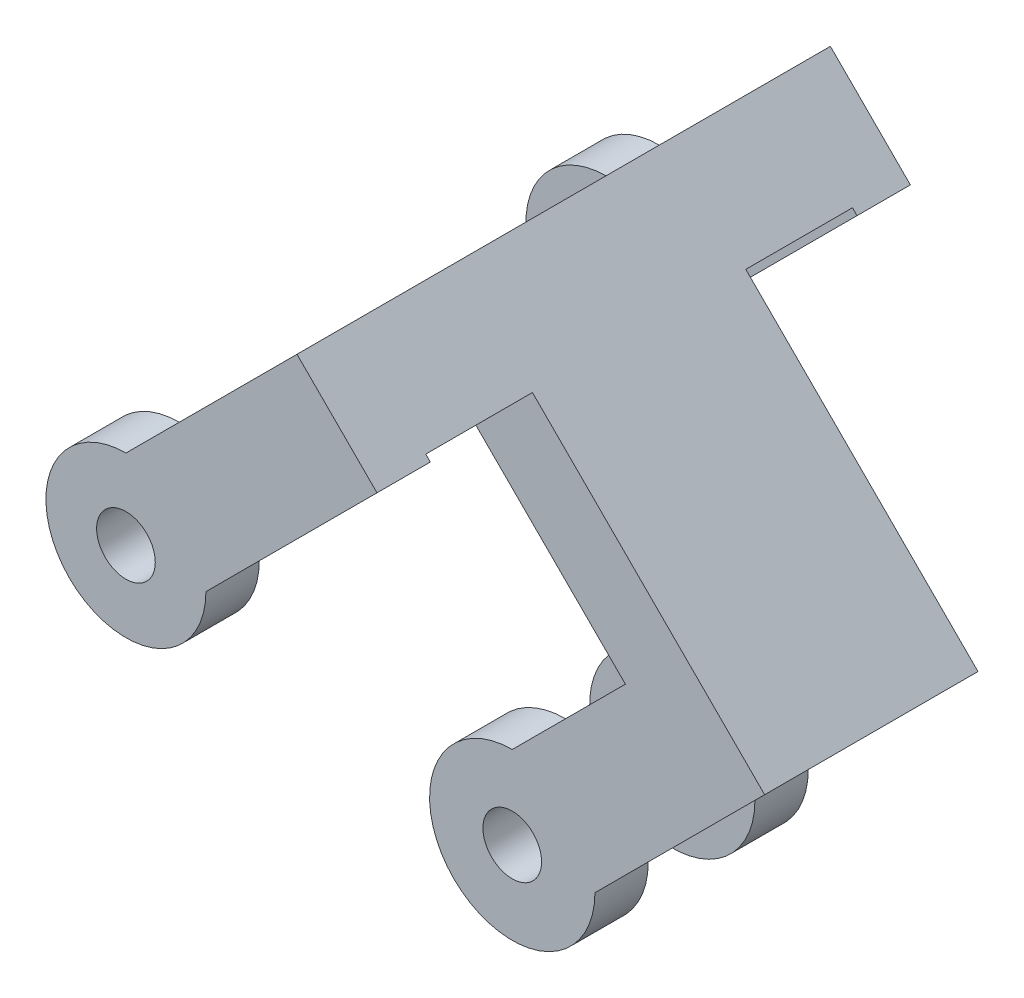
ISO-10303-21;
HEADER;
FILE_DESCRIPTION(('STEP AP214'),'2;1');
FILE_NAME('part.step','',(''),(''),'','','');
FILE_SCHEMA(('AUTOMOTIVE_DESIGN { 1 0 10303 214 1 1 1 1 }'));
ENDSEC;
DATA;
#1=APPLICATION_CONTEXT('core data for automotive mechanical design processes');
#2=APPLICATION_PROTOCOL_DEFINITION('international standard','automotive_design',2000,#1);
#3=PRODUCT_CONTEXT('',#1,'mechanical');
#4=PRODUCT('Part','Part','',(#3));
#5=PRODUCT_RELATED_PRODUCT_CATEGORY('part','',(#4));
#6=PRODUCT_DEFINITION_FORMATION('','',#4);
#7=PRODUCT_DEFINITION_CONTEXT('part definition',#1,'design');
#8=PRODUCT_DEFINITION('design','',#6,#7);
#9=PRODUCT_DEFINITION_SHAPE('','',#8);
#10=(LENGTH_UNIT() NAMED_UNIT(*) SI_UNIT(.MILLI.,.METRE.));
#11=(NAMED_UNIT(*) PLANE_ANGLE_UNIT() SI_UNIT($,.RADIAN.));
#12=(NAMED_UNIT(*) SI_UNIT($,.STERADIAN.) SOLID_ANGLE_UNIT());
#13=UNCERTAINTY_MEASURE_WITH_UNIT(LENGTH_MEASURE(1.E-05),#10,'distance_accuracy_value','');
#14=(GEOMETRIC_REPRESENTATION_CONTEXT(3) GLOBAL_UNCERTAINTY_ASSIGNED_CONTEXT((#13)) GLOBAL_UNIT_ASSIGNED_CONTEXT((#10,
#11,#12)) REPRESENTATION_CONTEXT('',''));
#15=CARTESIAN_POINT('',(0.,0.,0.));
#16=DIRECTION('',(0.,0.,1.));
#17=DIRECTION('',(1.,0.,0.));
#18=AXIS2_PLACEMENT_3D('',#15,#16,#17);
#19=CARTESIAN_POINT('',(-65.1262626584705,368.231601717798,-30.));
#20=DIRECTION('',(-0.707106781186552,0.707106781186543,0.));
#21=DIRECTION('',(-0.707106781186543,-0.707106781186552,0.));
#22=AXIS2_PLACEMENT_3D('',#19,#20,#21);
#23=PLANE('',#22);
#24=DIRECTION('',(0.707106781186543,0.707106781186552,0.));
#25=VECTOR('',#24,1.);
#26=CARTESIAN_POINT('',(-72.1973304703359,361.160533905932,-25.));
#27=LINE('',#26,#25);
#28=CARTESIAN_POINT('',(-72.1973304703359,361.160533905932,-25.));
#29=VERTEX_POINT('',#28);
#30=CARTESIAN_POINT('',(-66.8940296114366,366.463834764832,-25.));
#31=VERTEX_POINT('',#30);
#32=EDGE_CURVE('E242',#29,#31,#27,.T.);
#33=ORIENTED_EDGE('',*,*,#32,.T.);
#34=DIRECTION('',(0.,0.,-1.));
#35=VECTOR('',#34,1.);
#36=CARTESIAN_POINT('',(-66.8940296114366,366.463834764832,-15.));
#37=LINE('',#36,#35);
#38=CARTESIAN_POINT('',(-66.8940296114366,366.463834764832,-15.));
#39=VERTEX_POINT('',#38);
#40=EDGE_CURVE('E205',#39,#31,#37,.T.);
#41=ORIENTED_EDGE('',*,*,#40,.F.);
#42=DIRECTION('',(-0.707106781186543,-0.707106781186552,0.));
#43=VECTOR('',#42,1.);
#44=CARTESIAN_POINT('',(-65.1262626584705,368.231601717798,-15.));
#45=LINE('',#44,#43);
#46=CARTESIAN_POINT('',(-72.1973304703359,361.160533905932,-15.));
#47=VERTEX_POINT('',#46);
#48=EDGE_CURVE('E281',#39,#47,#45,.T.);
#49=ORIENTED_EDGE('',*,*,#48,.T.);
#50=DIRECTION('',(0.,0.,1.));
#51=VECTOR('',#50,1.);
#52=CARTESIAN_POINT('',(-72.1973304703359,361.160533905932,-30.));
#53=LINE('',#52,#51);
#54=EDGE_CURVE('E182',#29,#47,#53,.T.);
#55=ORIENTED_EDGE('',*,*,#54,.F.);
#56=EDGE_LOOP('',(#33,#41,#49,#55));
#57=FACE_BOUND('',#56,.T.);
#58=ADVANCED_FACE('F35',(#57),#23,.F.);
#59=CARTESIAN_POINT('',(-216.678932188134,216.678932188134,20.));
#60=DIRECTION('',(0.707106781186547,-0.707106781186547,0.));
#61=DIRECTION('',(0.707106781186548,0.707106781186548,0.));
#62=AXIS2_PLACEMENT_3D('',#59,#60,#61);
#63=PLANE('',#62);
#64=DIRECTION('',(-0.707106781186548,-0.707106781186548,0.));
#65=VECTOR('',#64,1.);
#66=CARTESIAN_POINT('',(-216.678932188134,216.678932188134,5.));
#67=LINE('',#66,#65);
#68=CARTESIAN_POINT('',(-66.8940296114366,366.463834764832,5.));
#69=VERTEX_POINT('',#68);
#70=CARTESIAN_POINT('',(-72.1973304703359,361.160533905933,5.));
#71=VERTEX_POINT('',#70);
#72=EDGE_CURVE('E173',#69,#71,#67,.T.);
#73=ORIENTED_EDGE('',*,*,#72,.F.);
#74=DIRECTION('',(0.,0.,-1.));
#75=VECTOR('',#74,1.);
#76=CARTESIAN_POINT('',(-66.8940296114366,366.463834764832,15.));
#77=LINE('',#76,#75);
#78=CARTESIAN_POINT('',(-66.8940296114366,366.463834764832,15.));
#79=VERTEX_POINT('',#78);
#80=EDGE_CURVE('E177',#79,#69,#77,.T.);
#81=ORIENTED_EDGE('',*,*,#80,.F.);
#82=DIRECTION('',(0.707106781186548,0.707106781186548,0.));
#83=VECTOR('',#82,1.);
#84=CARTESIAN_POINT('',(-216.678932188134,216.678932188134,15.));
#85=LINE('',#84,#83);
#86=CARTESIAN_POINT('',(-72.1973304703359,361.160533905932,15.));
#87=VERTEX_POINT('',#86);
#88=EDGE_CURVE('E59',#87,#79,#85,.T.);
#89=ORIENTED_EDGE('',*,*,#88,.F.);
#90=DIRECTION('',(0.,0.,-1.));
#91=VECTOR('',#90,1.);
#92=CARTESIAN_POINT('',(-72.1973304703359,361.160533905932,20.));
#93=LINE('',#92,#91);
#94=EDGE_CURVE('E178',#87,#71,#93,.T.);
#95=ORIENTED_EDGE('',*,*,#94,.T.);
#96=EDGE_LOOP('',(#73,#81,#89,#95));
#97=FACE_BOUND('',#96,.T.);
#98=ADVANCED_FACE('F175',(#97),#63,.T.);
#99=CARTESIAN_POINT('',(-79.2683982822014,368.231601717798,5.));
#100=DIRECTION('',(0.,0.,1.));
#101=DIRECTION('',(1.,0.,0.));
#102=AXIS2_PLACEMENT_3D('',#99,#100,#101);
#103=PLANE('',#102);
#104=CARTESIAN_POINT('',(-68.7867965644034,328.786796564403,5.));
#105=DIRECTION('',(0.,0.,1.));
#106=DIRECTION('',(1.,0.,0.));
#107=AXIS2_PLACEMENT_3D('',#104,#105,#106);
#108=CIRCLE('',#107,2.75000000000001);
#109=CARTESIAN_POINT('',(-66.0367965644034,328.786796564403,5.));
#110=VERTEX_POINT('',#109);
#111=EDGE_CURVE('E291',#110,#110,#108,.T.);
#112=ORIENTED_EDGE('',*,*,#111,.F.);
#113=EDGE_LOOP('',(#112));
#114=FACE_BOUND('',#113,.T.);
#115=DIRECTION('',(0.707106781186548,0.707106781186547,0.));
#116=VECTOR('',#115,1.);
#117=CARTESIAN_POINT('',(-50.4301948466052,339.393398282202,5.));
#118=LINE('',#117,#116);
#119=CARTESIAN_POINT('',(-61.0367965644034,328.786796564403,5.));
#120=VERTEX_POINT('',#119);
#121=CARTESIAN_POINT('',(-45.1268939877057,344.696699141101,5.));
#122=VERTEX_POINT('',#121);
#123=EDGE_CURVE('E188',#120,#122,#118,.T.);
#124=ORIENTED_EDGE('',*,*,#123,.T.);
#125=DIRECTION('',(0.707106781186547,-0.707106781186548,0.));
#126=VECTOR('',#125,1.);
#127=CARTESIAN_POINT('',(-66.8940296114366,366.463834764832,5.));
#128=LINE('',#127,#126);
#129=EDGE_CURVE('E185',#69,#122,#128,.T.);
#130=ORIENTED_EDGE('',*,*,#129,.F.);
#131=ORIENTED_EDGE('',*,*,#72,.T.);
#132=DIRECTION('',(0.707106781186547,-0.707106781186548,0.));
#133=VECTOR('',#132,1.);
#134=CARTESIAN_POINT('',(-79.2683982822014,368.231601717798,5.));
#135=LINE('',#134,#133);
#136=CARTESIAN_POINT('',(-58.1801948466052,347.143398282202,5.));
#137=VERTEX_POINT('',#136);
#138=EDGE_CURVE('E314',#71,#137,#135,.T.);
#139=ORIENTED_EDGE('',*,*,#138,.T.);
#140=DIRECTION('',(-0.707106781186546,-0.707106781186549,0.));
#141=VECTOR('',#140,1.);
#142=CARTESIAN_POINT('',(-56.0588745030456,349.264718625761,5.));
#143=LINE('',#142,#141);
#144=CARTESIAN_POINT('',(-68.7867965644034,336.536796564403,5.));
#145=VERTEX_POINT('',#144);
#146=EDGE_CURVE('E294',#137,#145,#143,.T.);
#147=ORIENTED_EDGE('',*,*,#146,.T.);
#148=CARTESIAN_POINT('',(-68.7867965644034,328.786796564403,5.));
#149=DIRECTION('',(0.,0.,1.));
#150=DIRECTION('',(1.,0.,0.));
#151=AXIS2_PLACEMENT_3D('',#148,#149,#150);
#152=CIRCLE('',#151,7.75);
#153=EDGE_CURVE('E308',#145,#120,#152,.T.);
#154=ORIENTED_EDGE('',*,*,#153,.T.);
#155=EDGE_LOOP('',(#124,#130,#131,#139,#147,#154));
#156=FACE_BOUND('',#155,.T.);
#157=ADVANCED_FACE('F186',(#114,#156),#103,.T.);
#158=CARTESIAN_POINT('',(-68.7867965644034,328.786796564403,-15.));
#159=DIRECTION('',(0.,0.,-1.));
#160=DIRECTION('',(-1.,0.,0.));
#161=AXIS2_PLACEMENT_3D('',#158,#159,#160);
#162=PLANE('',#161);
#163=CARTESIAN_POINT('',(-68.7867965644034,328.786796564403,-15.));
#164=DIRECTION('',(0.,0.,-1.));
#165=DIRECTION('',(-1.,0.,0.));
#166=AXIS2_PLACEMENT_3D('',#163,#164,#165);
#167=CIRCLE('',#166,2.75000000000001);
#168=CARTESIAN_POINT('',(-71.5367965644034,328.786796564403,-15.));
#169=VERTEX_POINT('',#168);
#170=EDGE_CURVE('E346',#169,#169,#167,.T.);
#171=ORIENTED_EDGE('',*,*,#170,.F.);
#172=EDGE_LOOP('',(#171));
#173=FACE_BOUND('',#172,.T.);
#174=ORIENTED_EDGE('',*,*,#48,.F.);
#175=DIRECTION('',(-0.707106781186547,0.707106781186548,0.));
#176=VECTOR('',#175,1.);
#177=CARTESIAN_POINT('',(-45.1268939877057,344.696699141101,-15.));
#178=LINE('',#177,#176);
#179=CARTESIAN_POINT('',(-45.1268939877057,344.696699141101,-15.));
#180=VERTEX_POINT('',#179);
#181=EDGE_CURVE('E202',#180,#39,#178,.T.);
#182=ORIENTED_EDGE('',*,*,#181,.F.);
#183=DIRECTION('',(0.707106781186548,0.707106781186547,0.));
#184=VECTOR('',#183,1.);
#185=CARTESIAN_POINT('',(-194.911796564403,194.911796564403,-15.));
#186=LINE('',#185,#184);
#187=CARTESIAN_POINT('',(-61.0367965644034,328.786796564403,-15.));
#188=VERTEX_POINT('',#187);
#189=EDGE_CURVE('E329',#188,#180,#186,.T.);
#190=ORIENTED_EDGE('',*,*,#189,.F.);
#191=CARTESIAN_POINT('',(-68.7867965644034,328.786796564403,-15.));
#192=DIRECTION('',(0.,0.,-1.));
#193=DIRECTION('',(-1.,0.,0.));
#194=AXIS2_PLACEMENT_3D('',#191,#192,#193);
#195=CIRCLE('',#194,7.75000000000001);
#196=CARTESIAN_POINT('',(-68.7867965644034,336.536796564404,-15.));
#197=VERTEX_POINT('',#196);
#198=EDGE_CURVE('E44',#188,#197,#195,.T.);
#199=ORIENTED_EDGE('',*,*,#198,.T.);
#200=DIRECTION('',(0.707106781186546,0.707106781186549,0.));
#201=VECTOR('',#200,1.);
#202=CARTESIAN_POINT('',(-202.661796564404,202.661796564403,-15.));
#203=LINE('',#202,#201);
#204=CARTESIAN_POINT('',(-58.1801948466052,347.143398282202,-15.));
#205=VERTEX_POINT('',#204);
#206=EDGE_CURVE('E334',#197,#205,#203,.T.);
#207=ORIENTED_EDGE('',*,*,#206,.T.);
#208=DIRECTION('',(-0.707106781186547,0.707106781186548,0.));
#209=VECTOR('',#208,1.);
#210=CARTESIAN_POINT('',(-79.2683982822014,368.231601717798,-15.));
#211=LINE('',#210,#209);
#212=EDGE_CURVE('E318',#205,#47,#211,.T.);
#213=ORIENTED_EDGE('',*,*,#212,.T.);
#214=EDGE_LOOP('',(#174,#182,#190,#199,#207,#213));
#215=FACE_BOUND('',#214,.T.);
#216=ADVANCED_FACE('F366',(#173,#215),#162,.T.);
#217=CARTESIAN_POINT('',(-194.911796564403,194.911796564403,-10.));
#218=DIRECTION('',(-0.707106781186547,0.707106781186548,0.));
#219=DIRECTION('',(-0.707106781186548,-0.707106781186547,0.));
#220=AXIS2_PLACEMENT_3D('',#217,#218,#219);
#221=PLANE('',#220);
#222=ORIENTED_EDGE('',*,*,#189,.T.);
#223=DIRECTION('',(0.,0.,-1.));
#224=VECTOR('',#223,1.);
#225=CARTESIAN_POINT('',(-45.1268939877057,344.696699141101,5.));
#226=LINE('',#225,#224);
#227=EDGE_CURVE('E192',#122,#180,#226,.T.);
#228=ORIENTED_EDGE('',*,*,#227,.F.);
#229=ORIENTED_EDGE('',*,*,#123,.F.);
#230=DIRECTION('',(0.,0.,-1.));
#231=VECTOR('',#230,1.);
#232=CARTESIAN_POINT('',(-61.0367965644034,328.786796564403,5.));
#233=LINE('',#232,#231);
#234=CARTESIAN_POINT('',(-61.0367965644034,328.786796564403,0.));
#235=VERTEX_POINT('',#234);
#236=EDGE_CURVE('E304',#120,#235,#233,.T.);
#237=ORIENTED_EDGE('',*,*,#236,.T.);
#238=DIRECTION('',(0.707106781186548,0.707106781186547,0.));
#239=VECTOR('',#238,1.);
#240=CARTESIAN_POINT('',(-61.0367965644034,328.786796564403,0.));
#241=LINE('',#240,#239);
#242=CARTESIAN_POINT('',(-50.4301948466052,339.393398282202,0.));
#243=VERTEX_POINT('',#242);
#244=EDGE_CURVE('E298',#235,#243,#241,.T.);
#245=ORIENTED_EDGE('',*,*,#244,.T.);
#246=DIRECTION('',(0.,0.,-1.));
#247=VECTOR('',#246,1.);
#248=CARTESIAN_POINT('',(-50.4301948466052,339.393398282202,5.));
#249=LINE('',#248,#247);
#250=CARTESIAN_POINT('',(-50.4301948466052,339.393398282202,-10.));
#251=VERTEX_POINT('',#250);
#252=EDGE_CURVE('E316',#243,#251,#249,.T.);
#253=ORIENTED_EDGE('',*,*,#252,.T.);
#254=DIRECTION('',(0.707106781186548,0.707106781186547,0.));
#255=VECTOR('',#254,1.);
#256=CARTESIAN_POINT('',(-194.911796564403,194.911796564403,-10.));
#257=LINE('',#256,#255);
#258=CARTESIAN_POINT('',(-61.0367965644034,328.786796564403,-10.));
#259=VERTEX_POINT('',#258);
#260=EDGE_CURVE('E330',#259,#251,#257,.T.);
#261=ORIENTED_EDGE('',*,*,#260,.F.);
#262=DIRECTION('',(0.,0.,-1.));
#263=VECTOR('',#262,1.);
#264=CARTESIAN_POINT('',(-61.0367965644034,328.786796564403,-10.));
#265=LINE('',#264,#263);
#266=EDGE_CURVE('E337',#259,#188,#265,.T.);
#267=ORIENTED_EDGE('',*,*,#266,.T.);
#268=EDGE_LOOP('',(#222,#228,#229,#237,#245,#253,#261,#267));
#269=FACE_BOUND('',#268,.T.);
#270=ADVANCED_FACE('F370',(#269),#221,.F.);
#271=CARTESIAN_POINT('',(-223.749999999999,223.750000000001,-10.));
#272=DIRECTION('',(-0.707106781186545,0.707106781186551,0.));
#273=DIRECTION('',(-0.707106781186551,-0.707106781186545,0.));
#274=AXIS2_PLACEMENT_3D('',#271,#272,#273);
#275=PLANE('',#274);
#276=DIRECTION('',(-0.707106781186548,-0.707106781186547,0.));
#277=VECTOR('',#276,1.);
#278=CARTESIAN_POINT('',(-223.75,223.75,20.));
#279=LINE('',#278,#277);
#280=CARTESIAN_POINT('',(-73.965097423302,373.534902576697,20.));
#281=VERTEX_POINT('',#280);
#282=CARTESIAN_POINT('',(-89.9999999999997,357.5,20.));
#283=VERTEX_POINT('',#282);
#284=EDGE_CURVE('E181',#281,#283,#279,.T.);
#285=ORIENTED_EDGE('',*,*,#284,.F.);
#286=DIRECTION('',(0.,0.,1.));
#287=VECTOR('',#286,1.);
#288=CARTESIAN_POINT('',(-73.965097423302,373.534902576697,-30.));
#289=LINE('',#288,#287);
#290=CARTESIAN_POINT('',(-73.965097423302,373.534902576697,-30.));
#291=VERTEX_POINT('',#290);
#292=EDGE_CURVE('E217',#291,#281,#289,.T.);
#293=ORIENTED_EDGE('',*,*,#292,.F.);
#294=DIRECTION('',(0.707106781186553,0.707106781186542,0.));
#295=VECTOR('',#294,1.);
#296=CARTESIAN_POINT('',(-79.2683982822014,368.231601717798,-30.));
#297=LINE('',#296,#295);
#298=CARTESIAN_POINT('',(-89.9999999999997,357.5,-30.));
#299=VERTEX_POINT('',#298);
#300=EDGE_CURVE('E284',#299,#291,#297,.T.);
#301=ORIENTED_EDGE('',*,*,#300,.F.);
#302=DIRECTION('',(0.,0.,-1.));
#303=VECTOR('',#302,1.);
#304=CARTESIAN_POINT('',(-89.9999999999997,357.5,-25.));
#305=LINE('',#304,#303);
#306=CARTESIAN_POINT('',(-89.9999999999997,357.5,-25.));
#307=VERTEX_POINT('',#306);
#308=EDGE_CURVE('E246',#307,#299,#305,.T.);
#309=ORIENTED_EDGE('',*,*,#308,.F.);
#310=DIRECTION('',(0.707106781186553,0.707106781186542,0.));
#311=VECTOR('',#310,1.);
#312=CARTESIAN_POINT('',(-89.9999999999997,357.5,-25.));
#313=LINE('',#312,#311);
#314=CARTESIAN_POINT('',(-79.2683982822014,368.231601717798,-25.));
#315=VERTEX_POINT('',#314);
#316=EDGE_CURVE('E236',#307,#315,#313,.T.);
#317=ORIENTED_EDGE('',*,*,#316,.T.);
#318=DIRECTION('',(0.,0.,1.));
#319=VECTOR('',#318,1.);
#320=CARTESIAN_POINT('',(-79.2683982822014,368.231601717798,5.));
#321=LINE('',#320,#319);
#322=CARTESIAN_POINT('',(-79.2683982822014,368.231601717798,15.));
#323=VERTEX_POINT('',#322);
#324=EDGE_CURVE('E51',#315,#323,#321,.T.);
#325=ORIENTED_EDGE('',*,*,#324,.T.);
#326=DIRECTION('',(0.707106781186555,0.70710678118654,0.));
#327=VECTOR('',#326,1.);
#328=CARTESIAN_POINT('',(-223.749999999999,223.750000000004,15.));
#329=LINE('',#328,#327);
#330=CARTESIAN_POINT('',(-89.9999999999997,357.5,15.));
#331=VERTEX_POINT('',#330);
#332=EDGE_CURVE('E256',#331,#323,#329,.T.);
#333=ORIENTED_EDGE('',*,*,#332,.F.);
#334=DIRECTION('',(0.,0.,1.));
#335=VECTOR('',#334,1.);
#336=CARTESIAN_POINT('',(-89.9999999999997,357.5,15.));
#337=LINE('',#336,#335);
#338=EDGE_CURVE('E272',#331,#283,#337,.T.);
#339=ORIENTED_EDGE('',*,*,#338,.T.);
#340=EDGE_LOOP('',(#285,#293,#301,#309,#317,#325,#333,#339));
#341=FACE_BOUND('',#340,.T.);
#342=ADVANCED_FACE('F384',(#341),#275,.T.);
#343=CARTESIAN_POINT('',(0.,0.,20.));
#344=DIRECTION('',(0.,0.,1.));
#345=DIRECTION('',(1.,0.,0.));
#346=AXIS2_PLACEMENT_3D('',#343,#344,#345);
#347=PLANE('',#346);
#348=CARTESIAN_POINT('',(-89.9999999999998,350.,20.));
#349=DIRECTION('',(0.,0.,1.));
#350=DIRECTION('',(1.,0.,0.));
#351=AXIS2_PLACEMENT_3D('',#348,#349,#350);
#352=CIRCLE('',#351,2.75000000000001);
#353=CARTESIAN_POINT('',(-87.2499999999998,350.,20.));
#354=VERTEX_POINT('',#353);
#355=EDGE_CURVE('E260',#354,#354,#352,.T.);
#356=ORIENTED_EDGE('',*,*,#355,.F.);
#357=EDGE_LOOP('',(#356));
#358=FACE_BOUND('',#357,.T.);
#359=DIRECTION('',(0.707106781186548,0.707106781186547,0.));
#360=VECTOR('',#359,1.);
#361=CARTESIAN_POINT('',(-216.25,216.25,20.));
#362=LINE('',#361,#360);
#363=CARTESIAN_POINT('',(-82.4999999999998,350.,20.));
#364=VERTEX_POINT('',#363);
#365=CARTESIAN_POINT('',(-66.4650974233021,366.034902576697,20.));
#366=VERTEX_POINT('',#365);
#367=EDGE_CURVE('E275',#364,#366,#362,.T.);
#368=ORIENTED_EDGE('',*,*,#367,.T.);
#369=DIRECTION('',(0.707106781186547,-0.707106781186547,0.));
#370=VECTOR('',#369,1.);
#371=CARTESIAN_POINT('',(-73.965097423302,373.534902576697,20.));
#372=LINE('',#371,#370);
#373=EDGE_CURVE('E220',#281,#366,#372,.T.);
#374=ORIENTED_EDGE('',*,*,#373,.F.);
#375=ORIENTED_EDGE('',*,*,#284,.T.);
#376=CARTESIAN_POINT('',(-89.9999999999998,350.,20.));
#377=DIRECTION('',(0.,0.,1.));
#378=DIRECTION('',(1.,0.,0.));
#379=AXIS2_PLACEMENT_3D('',#376,#377,#378);
#380=CIRCLE('',#379,7.5);
#381=EDGE_CURVE('E253',#283,#364,#380,.T.);
#382=ORIENTED_EDGE('',*,*,#381,.T.);
#383=EDGE_LOOP('',(#368,#374,#375,#382));
#384=FACE_BOUND('',#383,.T.);
#385=ADVANCED_FACE('F391',(#358,#384),#347,.T.);
#386=CARTESIAN_POINT('',(0.,0.,-30.));
#387=DIRECTION('',(0.,0.,-1.));
#388=DIRECTION('',(-1.,0.,0.));
#389=AXIS2_PLACEMENT_3D('',#386,#387,#388);
#390=PLANE('',#389);
#391=CARTESIAN_POINT('',(-89.9999999999998,350.,-30.));
#392=DIRECTION('',(0.,0.,-1.));
#393=DIRECTION('',(-1.,0.,0.));
#394=AXIS2_PLACEMENT_3D('',#391,#392,#393);
#395=CIRCLE('',#394,2.75000000000001);
#396=CARTESIAN_POINT('',(-92.7499999999998,350.,-30.));
#397=VERTEX_POINT('',#396);
#398=EDGE_CURVE('E226',#397,#397,#395,.T.);
#399=ORIENTED_EDGE('',*,*,#398,.F.);
#400=EDGE_LOOP('',(#399));
#401=FACE_BOUND('',#400,.T.);
#402=ORIENTED_EDGE('',*,*,#300,.T.);
#403=DIRECTION('',(-0.707106781186547,0.707106781186547,0.));
#404=VECTOR('',#403,1.);
#405=CARTESIAN_POINT('',(-66.4650974233021,366.034902576697,-30.));
#406=LINE('',#405,#404);
#407=CARTESIAN_POINT('',(-66.4650974233021,366.034902576697,-30.));
#408=VERTEX_POINT('',#407);
#409=EDGE_CURVE('E214',#408,#291,#406,.T.);
#410=ORIENTED_EDGE('',*,*,#409,.F.);
#411=DIRECTION('',(-0.707106781186548,-0.707106781186547,0.));
#412=VECTOR('',#411,1.);
#413=CARTESIAN_POINT('',(-64.697330470336,367.802669529664,-30.));
#414=LINE('',#413,#412);
#415=CARTESIAN_POINT('',(-82.4999999999998,350.,-30.));
#416=VERTEX_POINT('',#415);
#417=EDGE_CURVE('E237',#408,#416,#414,.T.);
#418=ORIENTED_EDGE('',*,*,#417,.T.);
#419=CARTESIAN_POINT('',(-89.9999999999998,350.,-30.));
#420=DIRECTION('',(0.,0.,-1.));
#421=DIRECTION('',(-1.,0.,0.));
#422=AXIS2_PLACEMENT_3D('',#419,#420,#421);
#423=CIRCLE('',#422,7.50000000000004);
#424=EDGE_CURVE('E230',#416,#299,#423,.T.);
#425=ORIENTED_EDGE('',*,*,#424,.T.);
#426=EDGE_LOOP('',(#402,#410,#418,#425));
#427=FACE_BOUND('',#426,.T.);
#428=ADVANCED_FACE('F397',(#401,#427),#390,.T.);
#429=CARTESIAN_POINT('',(-216.25,216.25,15.));
#430=DIRECTION('',(0.707106781186547,-0.707106781186548,0.));
#431=DIRECTION('',(0.707106781186548,0.707106781186547,0.));
#432=AXIS2_PLACEMENT_3D('',#429,#430,#431);
#433=PLANE('',#432);
#434=DIRECTION('',(0.707106781186548,0.707106781186547,0.));
#435=VECTOR('',#434,1.);
#436=CARTESIAN_POINT('',(-216.25,216.25,15.));
#437=LINE('',#436,#435);
#438=CARTESIAN_POINT('',(-82.4999999999998,350.,15.));
#439=VERTEX_POINT('',#438);
#440=CARTESIAN_POINT('',(-66.4650974233021,366.034902576697,15.));
#441=VERTEX_POINT('',#440);
#442=EDGE_CURVE('E263',#439,#441,#437,.T.);
#443=ORIENTED_EDGE('',*,*,#442,.T.);
#444=DIRECTION('',(0.,0.,-1.));
#445=VECTOR('',#444,1.);
#446=CARTESIAN_POINT('',(-66.4650974233021,366.034902576697,20.));
#447=LINE('',#446,#445);
#448=EDGE_CURVE('E223',#366,#441,#447,.T.);
#449=ORIENTED_EDGE('',*,*,#448,.F.);
#450=ORIENTED_EDGE('',*,*,#367,.F.);
#451=DIRECTION('',(0.,0.,1.));
#452=VECTOR('',#451,1.);
#453=CARTESIAN_POINT('',(-82.4999999999998,350.,15.));
#454=LINE('',#453,#452);
#455=EDGE_CURVE('E279',#439,#364,#454,.T.);
#456=ORIENTED_EDGE('',*,*,#455,.F.);
#457=EDGE_LOOP('',(#443,#449,#450,#456));
#458=FACE_BOUND('',#457,.T.);
#459=ADVANCED_FACE('F395',(#458),#433,.T.);
#460=CARTESIAN_POINT('',(0.,0.,15.));
#461=DIRECTION('',(0.,0.,1.));
#462=DIRECTION('',(1.,0.,0.));
#463=AXIS2_PLACEMENT_3D('',#460,#461,#462);
#464=PLANE('',#463);
#465=CARTESIAN_POINT('',(-89.9999999999998,350.,15.));
#466=DIRECTION('',(0.,0.,1.));
#467=DIRECTION('',(1.,0.,0.));
#468=AXIS2_PLACEMENT_3D('',#465,#466,#467);
#469=CIRCLE('',#468,2.75000000000001);
#470=CARTESIAN_POINT('',(-87.2499999999998,350.,15.));
#471=VERTEX_POINT('',#470);
#472=EDGE_CURVE('E269',#471,#471,#469,.T.);
#473=ORIENTED_EDGE('',*,*,#472,.T.);
#474=EDGE_LOOP('',(#473));
#475=FACE_BOUND('',#474,.T.);
#476=ORIENTED_EDGE('',*,*,#88,.T.);
#477=DIRECTION('',(-0.707106781186525,0.70710678118657,0.));
#478=VECTOR('',#477,1.);
#479=CARTESIAN_POINT('',(-66.4650974233021,366.034902576697,15.));
#480=LINE('',#479,#478);
#481=EDGE_CURVE('E198',#441,#79,#480,.T.);
#482=ORIENTED_EDGE('',*,*,#481,.F.);
#483=ORIENTED_EDGE('',*,*,#442,.F.);
#484=CARTESIAN_POINT('',(-89.9999999999998,350.,15.));
#485=DIRECTION('',(0.,0.,1.));
#486=DIRECTION('',(1.,0.,0.));
#487=AXIS2_PLACEMENT_3D('',#484,#485,#486);
#488=CIRCLE('',#487,7.5);
#489=EDGE_CURVE('E259',#331,#439,#488,.T.);
#490=ORIENTED_EDGE('',*,*,#489,.F.);
#491=ORIENTED_EDGE('',*,*,#332,.T.);
#492=DIRECTION('',(0.707106781186547,-0.707106781186548,0.));
#493=VECTOR('',#492,1.);
#494=CARTESIAN_POINT('',(144.481601717798,144.481601717798,15.));
#495=LINE('',#494,#493);
#496=EDGE_CURVE('E266',#323,#87,#495,.T.);
#497=ORIENTED_EDGE('',*,*,#496,.T.);
#498=EDGE_LOOP('',(#476,#482,#483,#490,#491,#497));
#499=FACE_BOUND('',#498,.T.);
#500=ADVANCED_FACE('F382',(#475,#499),#464,.F.);
#501=CARTESIAN_POINT('',(-64.697330470336,367.802669529664,-25.));
#502=DIRECTION('',(0.707106781186547,-0.707106781186548,0.));
#503=DIRECTION('',(0.707106781186548,0.707106781186547,0.));
#504=AXIS2_PLACEMENT_3D('',#501,#502,#503);
#505=PLANE('',#504);
#506=ORIENTED_EDGE('',*,*,#417,.F.);
#507=DIRECTION('',(0.,0.,-1.));
#508=VECTOR('',#507,1.);
#509=CARTESIAN_POINT('',(-66.4650974233021,366.034902576697,-25.));
#510=LINE('',#509,#508);
#511=CARTESIAN_POINT('',(-66.4650974233021,366.034902576697,-25.));
#512=VERTEX_POINT('',#511);
#513=EDGE_CURVE('E211',#512,#408,#510,.T.);
#514=ORIENTED_EDGE('',*,*,#513,.F.);
#515=DIRECTION('',(-0.707106781186548,-0.707106781186547,0.));
#516=VECTOR('',#515,1.);
#517=CARTESIAN_POINT('',(-64.697330470336,367.802669529664,-25.));
#518=LINE('',#517,#516);
#519=CARTESIAN_POINT('',(-82.4999999999998,350.,-25.));
#520=VERTEX_POINT('',#519);
#521=EDGE_CURVE('E244',#512,#520,#518,.T.);
#522=ORIENTED_EDGE('',*,*,#521,.T.);
#523=DIRECTION('',(0.,0.,-1.));
#524=VECTOR('',#523,1.);
#525=CARTESIAN_POINT('',(-82.4999999999998,350.,-25.));
#526=LINE('',#525,#524);
#527=EDGE_CURVE('E250',#520,#416,#526,.T.);
#528=ORIENTED_EDGE('',*,*,#527,.T.);
#529=EDGE_LOOP('',(#506,#514,#522,#528));
#530=FACE_BOUND('',#529,.T.);
#531=ADVANCED_FACE('F403',(#530),#505,.T.);
#532=CARTESIAN_POINT('',(-89.9999999999998,350.,-25.));
#533=DIRECTION('',(0.,0.,-1.));
#534=DIRECTION('',(-1.,0.,0.));
#535=AXIS2_PLACEMENT_3D('',#532,#533,#534);
#536=PLANE('',#535);
#537=CARTESIAN_POINT('',(-89.9999999999998,350.,-25.));
#538=DIRECTION('',(0.,0.,-1.));
#539=DIRECTION('',(-1.,0.,0.));
#540=AXIS2_PLACEMENT_3D('',#537,#538,#539);
#541=CIRCLE('',#540,2.75000000000001);
#542=CARTESIAN_POINT('',(-92.7499999999998,350.,-25.));
#543=VERTEX_POINT('',#542);
#544=EDGE_CURVE('E227',#543,#543,#541,.T.);
#545=ORIENTED_EDGE('',*,*,#544,.T.);
#546=EDGE_LOOP('',(#545));
#547=FACE_BOUND('',#546,.T.);
#548=ORIENTED_EDGE('',*,*,#521,.F.);
#549=DIRECTION('',(0.707106781186525,-0.70710678118657,0.));
#550=VECTOR('',#549,1.);
#551=CARTESIAN_POINT('',(-66.8940296114366,366.463834764832,-25.));
#552=LINE('',#551,#550);
#553=EDGE_CURVE('E208',#31,#512,#552,.T.);
#554=ORIENTED_EDGE('',*,*,#553,.F.);
#555=ORIENTED_EDGE('',*,*,#32,.F.);
#556=DIRECTION('',(0.707106781186545,-0.70710678118655,0.));
#557=VECTOR('',#556,1.);
#558=CARTESIAN_POINT('',(-79.2683982822014,368.231601717798,-25.));
#559=LINE('',#558,#557);
#560=EDGE_CURVE('E239',#315,#29,#559,.T.);
#561=ORIENTED_EDGE('',*,*,#560,.F.);
#562=ORIENTED_EDGE('',*,*,#316,.F.);
#563=CARTESIAN_POINT('',(-89.9999999999998,350.,-25.));
#564=DIRECTION('',(0.,0.,-1.));
#565=DIRECTION('',(-1.,0.,0.));
#566=AXIS2_PLACEMENT_3D('',#563,#564,#565);
#567=CIRCLE('',#566,7.50000000000004);
#568=EDGE_CURVE('E233',#520,#307,#567,.T.);
#569=ORIENTED_EDGE('',*,*,#568,.F.);
#570=EDGE_LOOP('',(#548,#554,#555,#561,#562,#569));
#571=FACE_BOUND('',#570,.T.);
#572=ADVANCED_FACE('F376',(#547,#571),#536,.F.);
#573=CARTESIAN_POINT('',(144.481601717798,144.481601717798,0.));
#574=DIRECTION('',(0.707106781186548,0.707106781186547,0.));
#575=DIRECTION('',(-0.707106781186547,0.707106781186548,0.));
#576=AXIS2_PLACEMENT_3D('',#573,#574,#575);
#577=PLANE('',#576);
#578=ORIENTED_EDGE('',*,*,#560,.T.);
#579=ORIENTED_EDGE('',*,*,#54,.T.);
#580=ORIENTED_EDGE('',*,*,#212,.F.);
#581=DIRECTION('',(0.,0.,-1.));
#582=VECTOR('',#581,1.);
#583=CARTESIAN_POINT('',(-58.1801948466052,347.143398282202,-10.));
#584=LINE('',#583,#582);
#585=CARTESIAN_POINT('',(-58.1801948466052,347.143398282202,-10.));
#586=VERTEX_POINT('',#585);
#587=EDGE_CURVE('E323',#586,#205,#584,.T.);
#588=ORIENTED_EDGE('',*,*,#587,.F.);
#589=DIRECTION('',(0.707106781186547,-0.707106781186548,0.));
#590=VECTOR('',#589,1.);
#591=CARTESIAN_POINT('',(-54.3051948466052,343.268398282202,-10.));
#592=LINE('',#591,#590);
#593=EDGE_CURVE('E326',#586,#251,#592,.T.);
#594=ORIENTED_EDGE('',*,*,#593,.T.);
#595=ORIENTED_EDGE('',*,*,#252,.F.);
#596=DIRECTION('',(0.707106781186547,-0.707106781186548,0.));
#597=VECTOR('',#596,1.);
#598=CARTESIAN_POINT('',(144.481601717798,144.481601717798,0.));
#599=LINE('',#598,#597);
#600=CARTESIAN_POINT('',(-58.1801948466052,347.143398282202,0.));
#601=VERTEX_POINT('',#600);
#602=EDGE_CURVE('E11',#601,#243,#599,.T.);
#603=ORIENTED_EDGE('',*,*,#602,.F.);
#604=DIRECTION('',(0.,0.,-1.));
#605=VECTOR('',#604,1.);
#606=CARTESIAN_POINT('',(-58.1801948466052,347.143398282202,0.));
#607=LINE('',#606,#605);
#608=EDGE_CURVE('E310',#137,#601,#607,.T.);
#609=ORIENTED_EDGE('',*,*,#608,.F.);
#610=ORIENTED_EDGE('',*,*,#138,.F.);
#611=ORIENTED_EDGE('',*,*,#94,.F.);
#612=ORIENTED_EDGE('',*,*,#496,.F.);
#613=ORIENTED_EDGE('',*,*,#324,.F.);
#614=EDGE_LOOP('',(#578,#579,#580,#588,#594,#595,#603,#609,#610,#611,#612,#613));
#615=FACE_BOUND('',#614,.T.);
#616=ADVANCED_FACE('F379',(#615),#577,.F.);
#617=CARTESIAN_POINT('',(-68.7867965644034,328.786796564403,-10.));
#618=DIRECTION('',(0.,0.,-1.));
#619=DIRECTION('',(-1.,0.,0.));
#620=AXIS2_PLACEMENT_3D('',#617,#618,#619);
#621=PLANE('',#620);
#622=CARTESIAN_POINT('',(-68.7867965644034,328.786796564403,-10.));
#623=DIRECTION('',(0.,0.,-1.));
#624=DIRECTION('',(-1.,0.,0.));
#625=AXIS2_PLACEMENT_3D('',#622,#623,#624);
#626=CIRCLE('',#625,2.75000000000001);
#627=CARTESIAN_POINT('',(-71.5367965644034,328.786796564403,-10.));
#628=VERTEX_POINT('',#627);
#629=EDGE_CURVE('E344',#628,#628,#626,.T.);
#630=ORIENTED_EDGE('',*,*,#629,.T.);
#631=EDGE_LOOP('',(#630));
#632=FACE_BOUND('',#631,.T.);
#633=ORIENTED_EDGE('',*,*,#593,.F.);
#634=DIRECTION('',(0.707106781186546,0.707106781186549,0.));
#635=VECTOR('',#634,1.);
#636=CARTESIAN_POINT('',(-202.661796564404,202.661796564403,-10.));
#637=LINE('',#636,#635);
#638=CARTESIAN_POINT('',(-68.7867965644034,336.536796564404,-10.));
#639=VERTEX_POINT('',#638);
#640=EDGE_CURVE('E333',#639,#586,#637,.T.);
#641=ORIENTED_EDGE('',*,*,#640,.F.);
#642=CARTESIAN_POINT('',(-68.7867965644034,328.786796564403,-10.));
#643=DIRECTION('',(0.,0.,-1.));
#644=DIRECTION('',(-1.,0.,0.));
#645=AXIS2_PLACEMENT_3D('',#642,#643,#644);
#646=CIRCLE('',#645,7.75000000000001);
#647=EDGE_CURVE('E349',#259,#639,#646,.T.);
#648=ORIENTED_EDGE('',*,*,#647,.F.);
#649=ORIENTED_EDGE('',*,*,#260,.T.);
#650=EDGE_LOOP('',(#633,#641,#648,#649));
#651=FACE_BOUND('',#650,.T.);
#652=ADVANCED_FACE('F362',(#632,#651),#621,.F.);
#653=CARTESIAN_POINT('',(-202.661796564404,202.661796564403,-10.));
#654=DIRECTION('',(-0.707106781186549,0.707106781186546,0.));
#655=DIRECTION('',(-0.707106781186546,-0.707106781186549,0.));
#656=AXIS2_PLACEMENT_3D('',#653,#654,#655);
#657=PLANE('',#656);
#658=ORIENTED_EDGE('',*,*,#640,.T.);
#659=ORIENTED_EDGE('',*,*,#587,.T.);
#660=ORIENTED_EDGE('',*,*,#206,.F.);
#661=DIRECTION('',(0.,0.,-1.));
#662=VECTOR('',#661,1.);
#663=CARTESIAN_POINT('',(-68.7867965644034,336.536796564404,-10.));
#664=LINE('',#663,#662);
#665=EDGE_CURVE('E341',#639,#197,#664,.T.);
#666=ORIENTED_EDGE('',*,*,#665,.F.);
#667=EDGE_LOOP('',(#658,#659,#660,#666));
#668=FACE_BOUND('',#667,.T.);
#669=ADVANCED_FACE('F364',(#668),#657,.T.);
#670=CARTESIAN_POINT('',(-68.7867965644034,328.786796564403,-15.));
#671=DIRECTION('',(0.,0.,1.));
#672=DIRECTION('',(1.,0.,0.));
#673=AXIS2_PLACEMENT_3D('',#670,#671,#672);
#674=CYLINDRICAL_SURFACE('',#673,7.75000000000001);
#675=ORIENTED_EDGE('',*,*,#647,.T.);
#676=ORIENTED_EDGE('',*,*,#665,.T.);
#677=ORIENTED_EDGE('',*,*,#198,.F.);
#678=ORIENTED_EDGE('',*,*,#266,.F.);
#679=EDGE_LOOP('',(#675,#676,#677,#678));
#680=FACE_BOUND('',#679,.T.);
#681=ADVANCED_FACE('F37',(#680),#674,.T.);
#682=CARTESIAN_POINT('',(-68.7867965644034,328.786796564403,-15.));
#683=DIRECTION('',(0.,0.,1.));
#684=DIRECTION('',(1.,0.,0.));
#685=AXIS2_PLACEMENT_3D('',#682,#683,#684);
#686=CYLINDRICAL_SURFACE('',#685,2.75000000000001);
#687=ORIENTED_EDGE('',*,*,#170,.T.);
#688=EDGE_LOOP('',(#687));
#689=FACE_BOUND('',#688,.T.);
#690=ORIENTED_EDGE('',*,*,#629,.F.);
#691=EDGE_LOOP('',(#690));
#692=FACE_BOUND('',#691,.T.);
#693=ADVANCED_FACE('F435',(#689,#692),#686,.F.);
#694=CARTESIAN_POINT('',(-68.7867965644034,328.786796564403,5.));
#695=DIRECTION('',(0.,0.,-1.));
#696=DIRECTION('',(-1.,0.,0.));
#697=AXIS2_PLACEMENT_3D('',#694,#695,#696);
#698=CYLINDRICAL_SURFACE('',#697,7.75);
#699=ORIENTED_EDGE('',*,*,#236,.F.);
#700=ORIENTED_EDGE('',*,*,#153,.F.);
#701=DIRECTION('',(0.,0.,-1.));
#702=VECTOR('',#701,1.);
#703=CARTESIAN_POINT('',(-68.7867965644034,336.536796564404,5.));
#704=LINE('',#703,#702);
#705=CARTESIAN_POINT('',(-68.7867965644034,336.536796564404,0.));
#706=VERTEX_POINT('',#705);
#707=EDGE_CURVE('E296',#145,#706,#704,.T.);
#708=ORIENTED_EDGE('',*,*,#707,.T.);
#709=CARTESIAN_POINT('',(-68.7867965644034,328.786796564403,0.));
#710=DIRECTION('',(0.,0.,1.));
#711=DIRECTION('',(1.,0.,0.));
#712=AXIS2_PLACEMENT_3D('',#709,#710,#711);
#713=CIRCLE('',#712,7.75);
#714=EDGE_CURVE('E307',#706,#235,#713,.T.);
#715=ORIENTED_EDGE('',*,*,#714,.T.);
#716=EDGE_LOOP('',(#699,#700,#708,#715));
#717=FACE_BOUND('',#716,.T.);
#718=ADVANCED_FACE('F428',(#717),#698,.T.);
#719=CARTESIAN_POINT('',(-56.0588745030456,349.264718625761,5.));
#720=DIRECTION('',(0.707106781186549,-0.707106781186546,0.));
#721=DIRECTION('',(0.707106781186546,0.707106781186549,0.));
#722=AXIS2_PLACEMENT_3D('',#719,#720,#721);
#723=PLANE('',#722);
#724=ORIENTED_EDGE('',*,*,#146,.F.);
#725=ORIENTED_EDGE('',*,*,#608,.T.);
#726=DIRECTION('',(-0.707106781186546,-0.707106781186549,0.));
#727=VECTOR('',#726,1.);
#728=CARTESIAN_POINT('',(-56.0588745030456,349.264718625761,0.));
#729=LINE('',#728,#727);
#730=EDGE_CURVE('E297',#601,#706,#729,.T.);
#731=ORIENTED_EDGE('',*,*,#730,.T.);
#732=ORIENTED_EDGE('',*,*,#707,.F.);
#733=EDGE_LOOP('',(#724,#725,#731,#732));
#734=FACE_BOUND('',#733,.T.);
#735=ADVANCED_FACE('F425',(#734),#723,.F.);
#736=CARTESIAN_POINT('',(-68.7867965644034,328.786796564403,0.));
#737=DIRECTION('',(0.,0.,1.));
#738=DIRECTION('',(1.,0.,0.));
#739=AXIS2_PLACEMENT_3D('',#736,#737,#738);
#740=PLANE('',#739);
#741=CARTESIAN_POINT('',(-68.7867965644034,328.786796564403,0.));
#742=DIRECTION('',(0.,0.,1.));
#743=DIRECTION('',(1.,0.,0.));
#744=AXIS2_PLACEMENT_3D('',#741,#742,#743);
#745=CIRCLE('',#744,2.75000000000001);
#746=CARTESIAN_POINT('',(-66.0367965644034,328.786796564403,0.));
#747=VERTEX_POINT('',#746);
#748=EDGE_CURVE('E39',#747,#747,#745,.T.);
#749=ORIENTED_EDGE('',*,*,#748,.T.);
#750=EDGE_LOOP('',(#749));
#751=FACE_BOUND('',#750,.T.);
#752=ORIENTED_EDGE('',*,*,#730,.F.);
#753=ORIENTED_EDGE('',*,*,#602,.T.);
#754=ORIENTED_EDGE('',*,*,#244,.F.);
#755=ORIENTED_EDGE('',*,*,#714,.F.);
#756=EDGE_LOOP('',(#752,#753,#754,#755));
#757=FACE_BOUND('',#756,.T.);
#758=ADVANCED_FACE('F423',(#751,#757),#740,.F.);
#759=CARTESIAN_POINT('',(-68.7867965644034,328.786796564403,-5.));
#760=DIRECTION('',(0.,0.,1.));
#761=DIRECTION('',(1.,0.,0.));
#762=AXIS2_PLACEMENT_3D('',#759,#760,#761);
#763=CYLINDRICAL_SURFACE('',#762,2.75000000000001);
#764=ORIENTED_EDGE('',*,*,#111,.T.);
#765=EDGE_LOOP('',(#764));
#766=FACE_BOUND('',#765,.T.);
#767=ORIENTED_EDGE('',*,*,#748,.F.);
#768=EDGE_LOOP('',(#767));
#769=FACE_BOUND('',#768,.T.);
#770=ADVANCED_FACE('F420',(#766,#769),#763,.F.);
#771=CARTESIAN_POINT('',(-89.9999999999998,350.,15.));
#772=DIRECTION('',(0.,0.,1.));
#773=DIRECTION('',(1.,0.,0.));
#774=AXIS2_PLACEMENT_3D('',#771,#772,#773);
#775=CYLINDRICAL_SURFACE('',#774,7.5);
#776=ORIENTED_EDGE('',*,*,#381,.F.);
#777=ORIENTED_EDGE('',*,*,#338,.F.);
#778=ORIENTED_EDGE('',*,*,#489,.T.);
#779=ORIENTED_EDGE('',*,*,#455,.T.);
#780=EDGE_LOOP('',(#776,#777,#778,#779));
#781=FACE_BOUND('',#780,.T.);
#782=ADVANCED_FACE('F388',(#781),#775,.T.);
#783=CARTESIAN_POINT('',(-89.9999999999998,350.,15.));
#784=DIRECTION('',(0.,0.,1.));
#785=DIRECTION('',(1.,0.,0.));
#786=AXIS2_PLACEMENT_3D('',#783,#784,#785);
#787=CYLINDRICAL_SURFACE('',#786,2.75000000000001);
#788=ORIENTED_EDGE('',*,*,#472,.F.);
#789=EDGE_LOOP('',(#788));
#790=FACE_BOUND('',#789,.T.);
#791=ORIENTED_EDGE('',*,*,#355,.T.);
#792=EDGE_LOOP('',(#791));
#793=FACE_BOUND('',#792,.T.);
#794=ADVANCED_FACE('F497',(#790,#793),#787,.F.);
#795=CARTESIAN_POINT('',(-89.9999999999998,350.,-25.));
#796=DIRECTION('',(0.,0.,-1.));
#797=DIRECTION('',(-1.,0.,0.));
#798=AXIS2_PLACEMENT_3D('',#795,#796,#797);
#799=CYLINDRICAL_SURFACE('',#798,7.50000000000004);
#800=ORIENTED_EDGE('',*,*,#424,.F.);
#801=ORIENTED_EDGE('',*,*,#527,.F.);
#802=ORIENTED_EDGE('',*,*,#568,.T.);
#803=ORIENTED_EDGE('',*,*,#308,.T.);
#804=EDGE_LOOP('',(#800,#801,#802,#803));
#805=FACE_BOUND('',#804,.T.);
#806=ADVANCED_FACE('F503',(#805),#799,.T.);
#807=CARTESIAN_POINT('',(-89.9999999999998,350.,-25.));
#808=DIRECTION('',(0.,0.,-1.));
#809=DIRECTION('',(-1.,0.,0.));
#810=AXIS2_PLACEMENT_3D('',#807,#808,#809);
#811=CYLINDRICAL_SURFACE('',#810,2.75000000000001);
#812=ORIENTED_EDGE('',*,*,#544,.F.);
#813=EDGE_LOOP('',(#812));
#814=FACE_BOUND('',#813,.T.);
#815=ORIENTED_EDGE('',*,*,#398,.T.);
#816=EDGE_LOOP('',(#815));
#817=FACE_BOUND('',#816,.T.);
#818=ADVANCED_FACE('F510',(#814,#817),#811,.F.);
#819=CARTESIAN_POINT('',(149.784902576698,149.784902576697,0.));
#820=DIRECTION('',(-0.707106781186548,-0.707106781186547,0.));
#821=DIRECTION('',(0.707106781186547,-0.707106781186548,0.));
#822=AXIS2_PLACEMENT_3D('',#819,#820,#821);
#823=PLANE('',#822);
#824=ORIENTED_EDGE('',*,*,#80,.T.);
#825=ORIENTED_EDGE('',*,*,#129,.T.);
#826=ORIENTED_EDGE('',*,*,#227,.T.);
#827=ORIENTED_EDGE('',*,*,#181,.T.);
#828=ORIENTED_EDGE('',*,*,#40,.T.);
#829=ORIENTED_EDGE('',*,*,#553,.T.);
#830=ORIENTED_EDGE('',*,*,#513,.T.);
#831=ORIENTED_EDGE('',*,*,#409,.T.);
#832=ORIENTED_EDGE('',*,*,#292,.T.);
#833=ORIENTED_EDGE('',*,*,#373,.T.);
#834=ORIENTED_EDGE('',*,*,#448,.T.);
#835=ORIENTED_EDGE('',*,*,#481,.T.);
#836=EDGE_LOOP('',(#824,#825,#826,#827,#828,#829,#830,#831,#832,#833,#834,#835));
#837=FACE_BOUND('',#836,.T.);
#838=ADVANCED_FACE('F195',(#837),#823,.F.);
#839=CLOSED_SHELL('',(#58,#98,#157,#216,#270,#342,#385,#428,#459,#500,#531,#572,#616,#652,#669,
#681,#693,#718,#735,#758,#770,#782,#794,#806,#818,#838));
#840=MANIFOLD_SOLID_BREP('B2',#839);
#841=ADVANCED_BREP_SHAPE_REPRESENTATION('',(#18,#840),#14);
#842=SHAPE_DEFINITION_REPRESENTATION(#9,#841);
ENDSEC;
END-ISO-10303-21;
